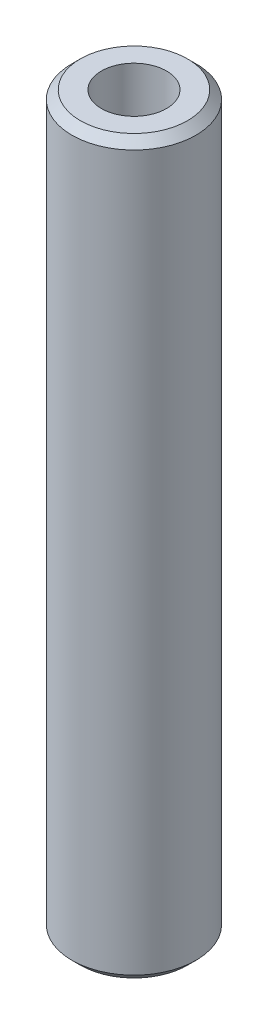
ISO-10303-21;
HEADER;
FILE_DESCRIPTION(('STEP AP214'),'2;1');
FILE_NAME('part.step','',(''),(''),'','','');
FILE_SCHEMA(('AUTOMOTIVE_DESIGN { 1 0 10303 214 1 1 1 1 }'));
ENDSEC;
DATA;
#1=APPLICATION_CONTEXT('core data for automotive mechanical design processes');
#2=APPLICATION_PROTOCOL_DEFINITION('international standard','automotive_design',2000,#1);
#3=PRODUCT_CONTEXT('',#1,'mechanical');
#4=PRODUCT('Part','Part','',(#3));
#5=PRODUCT_RELATED_PRODUCT_CATEGORY('part','',(#4));
#6=PRODUCT_DEFINITION_FORMATION('','',#4);
#7=PRODUCT_DEFINITION_CONTEXT('part definition',#1,'design');
#8=PRODUCT_DEFINITION('design','',#6,#7);
#9=PRODUCT_DEFINITION_SHAPE('','',#8);
#10=(LENGTH_UNIT() NAMED_UNIT(*) SI_UNIT(.MILLI.,.METRE.));
#11=(NAMED_UNIT(*) PLANE_ANGLE_UNIT() SI_UNIT($,.RADIAN.));
#12=(NAMED_UNIT(*) SI_UNIT($,.STERADIAN.) SOLID_ANGLE_UNIT());
#13=UNCERTAINTY_MEASURE_WITH_UNIT(LENGTH_MEASURE(1.E-05),#10,'distance_accuracy_value','');
#14=(GEOMETRIC_REPRESENTATION_CONTEXT(3) GLOBAL_UNCERTAINTY_ASSIGNED_CONTEXT((#13)) GLOBAL_UNIT_ASSIGNED_CONTEXT((#10,
#11,#12)) REPRESENTATION_CONTEXT('',''));
#15=CARTESIAN_POINT('',(0.,0.,0.));
#16=DIRECTION('',(0.,0.,1.));
#17=DIRECTION('',(1.,0.,0.));
#18=AXIS2_PLACEMENT_3D('',#15,#16,#17);
#19=CARTESIAN_POINT('',(0.,34.8,0.));
#20=DIRECTION('',(0.,1.,0.));
#21=DIRECTION('',(0.,0.,1.));
#22=AXIS2_PLACEMENT_3D('',#19,#20,#21);
#23=PLANE('',#22);
#24=CARTESIAN_POINT('',(0.,34.8,0.));
#25=DIRECTION('',(0.,1.,0.));
#26=DIRECTION('',(0.,0.,1.));
#27=AXIS2_PLACEMENT_3D('',#24,#25,#26);
#28=CIRCLE('',#27,2.55);
#29=CARTESIAN_POINT('',(0.,34.8,2.55));
#30=VERTEX_POINT('',#29);
#31=EDGE_CURVE('E47',#30,#30,#28,.T.);
#32=ORIENTED_EDGE('',*,*,#31,.T.);
#33=EDGE_LOOP('',(#32));
#34=FACE_BOUND('',#33,.T.);
#35=CARTESIAN_POINT('',(0.,34.8,0.));
#36=DIRECTION('',(0.,1.,0.));
#37=DIRECTION('',(0.,0.,1.));
#38=AXIS2_PLACEMENT_3D('',#35,#36,#37);
#39=CIRCLE('',#38,1.55);
#40=CARTESIAN_POINT('',(0.,34.8,1.55));
#41=VERTEX_POINT('',#40);
#42=EDGE_CURVE('E60',#41,#41,#39,.T.);
#43=ORIENTED_EDGE('',*,*,#42,.F.);
#44=EDGE_LOOP('',(#43));
#45=FACE_BOUND('',#44,.T.);
#46=ADVANCED_FACE('F39',(#34,#45),#23,.T.);
#47=CARTESIAN_POINT('',(0.,0.,0.));
#48=DIRECTION('',(0.,1.,0.));
#49=DIRECTION('',(0.,0.,1.));
#50=AXIS2_PLACEMENT_3D('',#47,#48,#49);
#51=PLANE('',#50);
#52=CARTESIAN_POINT('',(0.,0.,0.));
#53=DIRECTION('',(0.,1.,0.));
#54=DIRECTION('',(0.,0.,1.));
#55=AXIS2_PLACEMENT_3D('',#52,#53,#54);
#56=CIRCLE('',#55,2.55);
#57=CARTESIAN_POINT('',(0.,0.,2.55));
#58=VERTEX_POINT('',#57);
#59=EDGE_CURVE('E51',#58,#58,#56,.F.);
#60=ORIENTED_EDGE('',*,*,#59,.T.);
#61=EDGE_LOOP('',(#60));
#62=FACE_BOUND('',#61,.T.);
#63=CARTESIAN_POINT('',(0.,0.,0.));
#64=DIRECTION('',(0.,1.,0.));
#65=DIRECTION('',(0.,0.,1.));
#66=AXIS2_PLACEMENT_3D('',#63,#64,#65);
#67=CIRCLE('',#66,1.55);
#68=CARTESIAN_POINT('',(0.,0.,1.55));
#69=VERTEX_POINT('',#68);
#70=EDGE_CURVE('E61',#69,#69,#67,.T.);
#71=ORIENTED_EDGE('',*,*,#70,.T.);
#72=EDGE_LOOP('',(#71));
#73=FACE_BOUND('',#72,.T.);
#74=ADVANCED_FACE('F71',(#62,#73),#51,.F.);
#75=CARTESIAN_POINT('',(0.,34.8,0.));
#76=DIRECTION('',(0.,-1.,0.));
#77=DIRECTION('',(0.,0.,-1.));
#78=AXIS2_PLACEMENT_3D('',#75,#76,#77);
#79=CYLINDRICAL_SURFACE('',#78,2.95);
#80=CARTESIAN_POINT('',(0.,34.4,0.));
#81=DIRECTION('',(0.,1.,0.));
#82=DIRECTION('',(0.,0.,1.));
#83=AXIS2_PLACEMENT_3D('',#80,#81,#82);
#84=CIRCLE('',#83,2.95);
#85=CARTESIAN_POINT('',(0.,34.4,2.95));
#86=VERTEX_POINT('',#85);
#87=EDGE_CURVE('E10',#86,#86,#84,.F.);
#88=ORIENTED_EDGE('',*,*,#87,.T.);
#89=EDGE_LOOP('',(#88));
#90=FACE_BOUND('',#89,.T.);
#91=CARTESIAN_POINT('',(0.,0.400000000000005,0.));
#92=DIRECTION('',(0.,1.,0.));
#93=DIRECTION('',(0.,0.,1.));
#94=AXIS2_PLACEMENT_3D('',#91,#92,#93);
#95=CIRCLE('',#94,2.95);
#96=CARTESIAN_POINT('',(0.,0.400000000000005,2.95));
#97=VERTEX_POINT('',#96);
#98=EDGE_CURVE('E55',#97,#97,#95,.T.);
#99=ORIENTED_EDGE('',*,*,#98,.T.);
#100=EDGE_LOOP('',(#99));
#101=FACE_BOUND('',#100,.T.);
#102=ADVANCED_FACE('F78',(#90,#101),#79,.T.);
#103=CARTESIAN_POINT('',(0.,34.8,0.));
#104=DIRECTION('',(0.,-1.,0.));
#105=DIRECTION('',(0.,0.,-1.));
#106=AXIS2_PLACEMENT_3D('',#103,#104,#105);
#107=CYLINDRICAL_SURFACE('',#106,1.55);
#108=ORIENTED_EDGE('',*,*,#42,.T.);
#109=EDGE_LOOP('',(#108));
#110=FACE_BOUND('',#109,.T.);
#111=ORIENTED_EDGE('',*,*,#70,.F.);
#112=EDGE_LOOP('',(#111));
#113=FACE_BOUND('',#112,.T.);
#114=ADVANCED_FACE('F67',(#110,#113),#107,.F.);
#115=CARTESIAN_POINT('',(0.,0.400000000000005,0.));
#116=DIRECTION('',(0.,1.,0.));
#117=DIRECTION('',(0.,0.,1.));
#118=AXIS2_PLACEMENT_3D('',#115,#116,#117);
#119=CONICAL_SURFACE('',#118,2.95,0.785398163397448);
#120=ORIENTED_EDGE('',*,*,#59,.F.);
#121=EDGE_LOOP('',(#120));
#122=FACE_BOUND('',#121,.T.);
#123=ORIENTED_EDGE('',*,*,#98,.F.);
#124=EDGE_LOOP('',(#123));
#125=FACE_BOUND('',#124,.T.);
#126=ADVANCED_FACE('F84',(#122,#125),#119,.T.);
#127=CARTESIAN_POINT('',(0.,34.8,0.));
#128=DIRECTION('',(0.,-1.,0.));
#129=DIRECTION('',(0.,0.,-1.));
#130=AXIS2_PLACEMENT_3D('',#127,#128,#129);
#131=CONICAL_SURFACE('',#130,2.55,0.785398163397452);
#132=ORIENTED_EDGE('',*,*,#87,.F.);
#133=EDGE_LOOP('',(#132));
#134=FACE_BOUND('',#133,.T.);
#135=ORIENTED_EDGE('',*,*,#31,.F.);
#136=EDGE_LOOP('',(#135));
#137=FACE_BOUND('',#136,.T.);
#138=ADVANCED_FACE('F42',(#134,#137),#131,.T.);
#139=CLOSED_SHELL('',(#46,#74,#102,#114,#126,#138));
#140=MANIFOLD_SOLID_BREP('B2',#139);
#141=ADVANCED_BREP_SHAPE_REPRESENTATION('',(#18,#140),#14);
#142=SHAPE_DEFINITION_REPRESENTATION(#9,#141);
ENDSEC;
END-ISO-10303-21;
